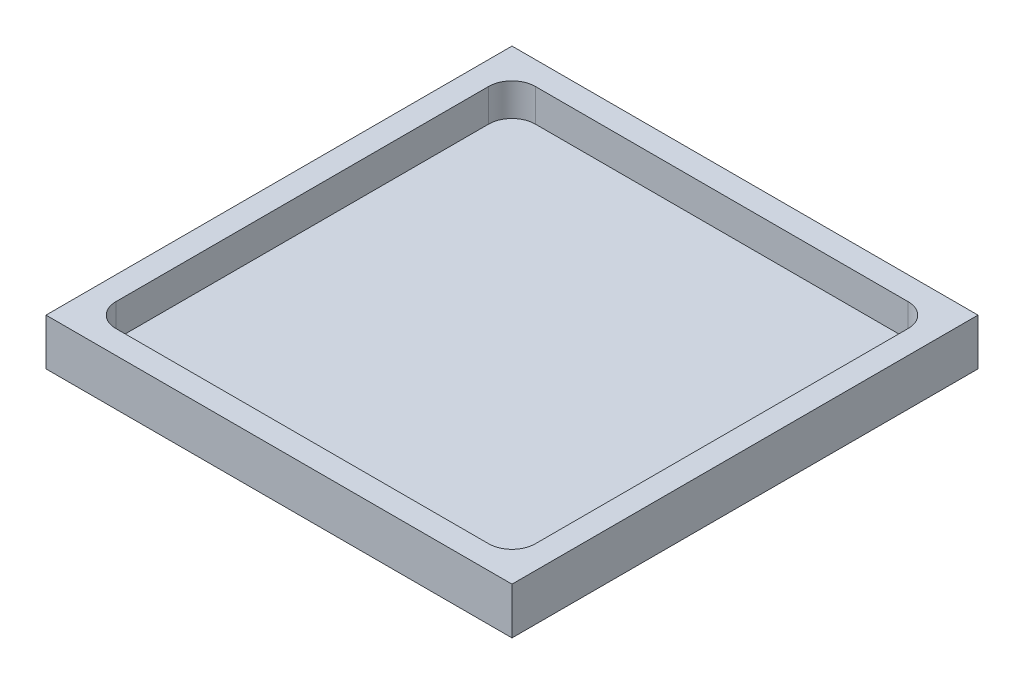
ISO-10303-21;
HEADER;
FILE_DESCRIPTION(('STEP AP214'),'2;1');
FILE_NAME('part.step','',(''),(''),'','','');
FILE_SCHEMA(('AUTOMOTIVE_DESIGN { 1 0 10303 214 1 1 1 1 }'));
ENDSEC;
DATA;
#1=APPLICATION_CONTEXT('core data for automotive mechanical design processes');
#2=APPLICATION_PROTOCOL_DEFINITION('international standard','automotive_design',2000,#1);
#3=PRODUCT_CONTEXT('',#1,'mechanical');
#4=PRODUCT('Part','Part','',(#3));
#5=PRODUCT_RELATED_PRODUCT_CATEGORY('part','',(#4));
#6=PRODUCT_DEFINITION_FORMATION('','',#4);
#7=PRODUCT_DEFINITION_CONTEXT('part definition',#1,'design');
#8=PRODUCT_DEFINITION('design','',#6,#7);
#9=PRODUCT_DEFINITION_SHAPE('','',#8);
#10=(LENGTH_UNIT() NAMED_UNIT(*) SI_UNIT(.MILLI.,.METRE.));
#11=(NAMED_UNIT(*) PLANE_ANGLE_UNIT() SI_UNIT($,.RADIAN.));
#12=(NAMED_UNIT(*) SI_UNIT($,.STERADIAN.) SOLID_ANGLE_UNIT());
#13=UNCERTAINTY_MEASURE_WITH_UNIT(LENGTH_MEASURE(1.E-05),#10,'distance_accuracy_value','');
#14=(GEOMETRIC_REPRESENTATION_CONTEXT(3) GLOBAL_UNCERTAINTY_ASSIGNED_CONTEXT((#13)) GLOBAL_UNIT_ASSIGNED_CONTEXT((#10,
#11,#12)) REPRESENTATION_CONTEXT('',''));
#15=CARTESIAN_POINT('',(0.,0.,0.));
#16=DIRECTION('',(0.,0.,1.));
#17=DIRECTION('',(1.,0.,0.));
#18=AXIS2_PLACEMENT_3D('',#15,#16,#17);
#19=CARTESIAN_POINT('',(0.,10.,0.));
#20=DIRECTION('',(1.,0.,0.));
#21=DIRECTION('',(0.,0.,-1.));
#22=AXIS2_PLACEMENT_3D('',#19,#20,#21);
#23=PLANE('',#22);
#24=DIRECTION('',(0.,0.,1.));
#25=VECTOR('',#24,1.);
#26=CARTESIAN_POINT('',(0.,0.,0.));
#27=LINE('',#26,#25);
#28=CARTESIAN_POINT('',(0.,0.,-100.));
#29=VERTEX_POINT('',#28);
#30=CARTESIAN_POINT('',(0.,0.,0.));
#31=VERTEX_POINT('',#30);
#32=EDGE_CURVE('E153',#29,#31,#27,.T.);
#33=ORIENTED_EDGE('',*,*,#32,.T.);
#34=DIRECTION('',(0.,-1.,0.));
#35=VECTOR('',#34,1.);
#36=CARTESIAN_POINT('',(0.,10.,0.));
#37=LINE('',#36,#35);
#38=CARTESIAN_POINT('',(0.,10.,0.));
#39=VERTEX_POINT('',#38);
#40=EDGE_CURVE('E132',#39,#31,#37,.T.);
#41=ORIENTED_EDGE('',*,*,#40,.F.);
#42=DIRECTION('',(0.,0.,1.));
#43=VECTOR('',#42,1.);
#44=CARTESIAN_POINT('',(0.,10.,0.));
#45=LINE('',#44,#43);
#46=CARTESIAN_POINT('',(0.,10.,-100.));
#47=VERTEX_POINT('',#46);
#48=EDGE_CURVE('E140',#47,#39,#45,.T.);
#49=ORIENTED_EDGE('',*,*,#48,.F.);
#50=DIRECTION('',(0.,-1.,0.));
#51=VECTOR('',#50,1.);
#52=CARTESIAN_POINT('',(0.,10.,-100.));
#53=LINE('',#52,#51);
#54=EDGE_CURVE('E257',#47,#29,#53,.T.);
#55=ORIENTED_EDGE('',*,*,#54,.T.);
#56=EDGE_LOOP('',(#33,#41,#49,#55));
#57=FACE_BOUND('',#56,.T.);
#58=ADVANCED_FACE('F39',(#57),#23,.F.);
#59=CARTESIAN_POINT('',(0.,10.,0.));
#60=DIRECTION('',(0.,0.,-1.));
#61=DIRECTION('',(-1.,0.,0.));
#62=AXIS2_PLACEMENT_3D('',#59,#60,#61);
#63=PLANE('',#62);
#64=DIRECTION('',(1.,0.,0.));
#65=VECTOR('',#64,1.);
#66=CARTESIAN_POINT('',(0.,0.,0.));
#67=LINE('',#66,#65);
#68=CARTESIAN_POINT('',(100.,0.,0.));
#69=VERTEX_POINT('',#68);
#70=EDGE_CURVE('E260',#31,#69,#67,.T.);
#71=ORIENTED_EDGE('',*,*,#70,.T.);
#72=DIRECTION('',(0.,-1.,0.));
#73=VECTOR('',#72,1.);
#74=CARTESIAN_POINT('',(100.,10.,0.));
#75=LINE('',#74,#73);
#76=CARTESIAN_POINT('',(100.,10.,0.));
#77=VERTEX_POINT('',#76);
#78=EDGE_CURVE('E135',#77,#69,#75,.T.);
#79=ORIENTED_EDGE('',*,*,#78,.F.);
#80=DIRECTION('',(1.,0.,0.));
#81=VECTOR('',#80,1.);
#82=CARTESIAN_POINT('',(0.,10.,0.));
#83=LINE('',#82,#81);
#84=EDGE_CURVE('E128',#39,#77,#83,.T.);
#85=ORIENTED_EDGE('',*,*,#84,.F.);
#86=ORIENTED_EDGE('',*,*,#40,.T.);
#87=EDGE_LOOP('',(#71,#79,#85,#86));
#88=FACE_BOUND('',#87,.T.);
#89=ADVANCED_FACE('F130',(#88),#63,.F.);
#90=CARTESIAN_POINT('',(100.,10.,0.));
#91=DIRECTION('',(-1.,0.,0.));
#92=DIRECTION('',(0.,0.,1.));
#93=AXIS2_PLACEMENT_3D('',#90,#91,#92);
#94=PLANE('',#93);
#95=DIRECTION('',(0.,0.,-1.));
#96=VECTOR('',#95,1.);
#97=CARTESIAN_POINT('',(100.,0.,0.));
#98=LINE('',#97,#96);
#99=CARTESIAN_POINT('',(100.,0.,-100.));
#100=VERTEX_POINT('',#99);
#101=EDGE_CURVE('E263',#69,#100,#98,.T.);
#102=ORIENTED_EDGE('',*,*,#101,.T.);
#103=DIRECTION('',(0.,-1.,0.));
#104=VECTOR('',#103,1.);
#105=CARTESIAN_POINT('',(100.,10.,-100.));
#106=LINE('',#105,#104);
#107=CARTESIAN_POINT('',(100.,10.,-100.));
#108=VERTEX_POINT('',#107);
#109=EDGE_CURVE('E161',#108,#100,#106,.T.);
#110=ORIENTED_EDGE('',*,*,#109,.F.);
#111=DIRECTION('',(0.,0.,-1.));
#112=VECTOR('',#111,1.);
#113=CARTESIAN_POINT('',(100.,10.,0.));
#114=LINE('',#113,#112);
#115=EDGE_CURVE('E139',#77,#108,#114,.T.);
#116=ORIENTED_EDGE('',*,*,#115,.F.);
#117=ORIENTED_EDGE('',*,*,#78,.T.);
#118=EDGE_LOOP('',(#102,#110,#116,#117));
#119=FACE_BOUND('',#118,.T.);
#120=ADVANCED_FACE('F279',(#119),#94,.F.);
#121=CARTESIAN_POINT('',(0.,10.,-100.));
#122=DIRECTION('',(0.,0.,1.));
#123=DIRECTION('',(1.,0.,0.));
#124=AXIS2_PLACEMENT_3D('',#121,#122,#123);
#125=PLANE('',#124);
#126=DIRECTION('',(-1.,0.,0.));
#127=VECTOR('',#126,1.);
#128=CARTESIAN_POINT('',(0.,0.,-100.));
#129=LINE('',#128,#127);
#130=EDGE_CURVE('E150',#100,#29,#129,.T.);
#131=ORIENTED_EDGE('',*,*,#130,.T.);
#132=ORIENTED_EDGE('',*,*,#54,.F.);
#133=DIRECTION('',(-1.,0.,0.));
#134=VECTOR('',#133,1.);
#135=CARTESIAN_POINT('',(0.,10.,-100.));
#136=LINE('',#135,#134);
#137=EDGE_CURVE('E145',#108,#47,#136,.T.);
#138=ORIENTED_EDGE('',*,*,#137,.F.);
#139=ORIENTED_EDGE('',*,*,#109,.T.);
#140=EDGE_LOOP('',(#131,#132,#138,#139));
#141=FACE_BOUND('',#140,.T.);
#142=ADVANCED_FACE('F274',(#141),#125,.F.);
#143=CARTESIAN_POINT('',(0.,10.,0.));
#144=DIRECTION('',(0.,-1.,0.));
#145=DIRECTION('',(0.,0.,-1.));
#146=AXIS2_PLACEMENT_3D('',#143,#144,#145);
#147=PLANE('',#146);
#148=DIRECTION('',(1.,0.,0.));
#149=VECTOR('',#148,1.);
#150=CARTESIAN_POINT('',(5.00000000000001,10.,-5.00000000000002));
#151=LINE('',#150,#149);
#152=CARTESIAN_POINT('',(10.,10.,-5.00000000000002));
#153=VERTEX_POINT('',#152);
#154=CARTESIAN_POINT('',(90.,10.,-5.00000000000001));
#155=VERTEX_POINT('',#154);
#156=EDGE_CURVE('E208',#153,#155,#151,.T.);
#157=ORIENTED_EDGE('',*,*,#156,.F.);
#158=CARTESIAN_POINT('',(10.,10.,-10.));
#159=DIRECTION('',(0.,-1.,0.));
#160=DIRECTION('',(0.,0.,-1.));
#161=AXIS2_PLACEMENT_3D('',#158,#159,#160);
#162=CIRCLE('',#161,5.);
#163=CARTESIAN_POINT('',(5.00000000000001,10.,-10.));
#164=VERTEX_POINT('',#163);
#165=EDGE_CURVE('E48',#153,#164,#162,.T.);
#166=ORIENTED_EDGE('',*,*,#165,.T.);
#167=DIRECTION('',(0.,0.,1.));
#168=VECTOR('',#167,1.);
#169=CARTESIAN_POINT('',(5.,10.,-95.));
#170=LINE('',#169,#168);
#171=CARTESIAN_POINT('',(5.,10.,-90.));
#172=VERTEX_POINT('',#171);
#173=EDGE_CURVE('E220',#172,#164,#170,.T.);
#174=ORIENTED_EDGE('',*,*,#173,.F.);
#175=CARTESIAN_POINT('',(10.,10.,-90.));
#176=DIRECTION('',(0.,-1.,0.));
#177=DIRECTION('',(0.,0.,-1.));
#178=AXIS2_PLACEMENT_3D('',#175,#176,#177);
#179=CIRCLE('',#178,5.);
#180=CARTESIAN_POINT('',(10.,10.,-95.));
#181=VERTEX_POINT('',#180);
#182=EDGE_CURVE('E11',#172,#181,#179,.T.);
#183=ORIENTED_EDGE('',*,*,#182,.T.);
#184=DIRECTION('',(-1.,0.,0.));
#185=VECTOR('',#184,1.);
#186=CARTESIAN_POINT('',(5.,10.,-95.));
#187=LINE('',#186,#185);
#188=CARTESIAN_POINT('',(90.,10.,-95.));
#189=VERTEX_POINT('',#188);
#190=EDGE_CURVE('E249',#189,#181,#187,.T.);
#191=ORIENTED_EDGE('',*,*,#190,.F.);
#192=CARTESIAN_POINT('',(90.,10.,-90.));
#193=DIRECTION('',(0.,-1.,0.));
#194=DIRECTION('',(0.,0.,-1.));
#195=AXIS2_PLACEMENT_3D('',#192,#193,#194);
#196=CIRCLE('',#195,5.);
#197=CARTESIAN_POINT('',(95.,10.,-90.));
#198=VERTEX_POINT('',#197);
#199=EDGE_CURVE('E200',#189,#198,#196,.T.);
#200=ORIENTED_EDGE('',*,*,#199,.T.);
#201=DIRECTION('',(0.,0.,-1.));
#202=VECTOR('',#201,1.);
#203=CARTESIAN_POINT('',(95.,10.,-95.));
#204=LINE('',#203,#202);
#205=CARTESIAN_POINT('',(95.,10.,-10.));
#206=VERTEX_POINT('',#205);
#207=EDGE_CURVE('E210',#206,#198,#204,.T.);
#208=ORIENTED_EDGE('',*,*,#207,.F.);
#209=CARTESIAN_POINT('',(90.,10.,-10.));
#210=DIRECTION('',(0.,-1.,0.));
#211=DIRECTION('',(0.,0.,-1.));
#212=AXIS2_PLACEMENT_3D('',#209,#210,#211);
#213=CIRCLE('',#212,5.);
#214=EDGE_CURVE('E203',#206,#155,#213,.T.);
#215=ORIENTED_EDGE('',*,*,#214,.T.);
#216=EDGE_LOOP('',(#157,#166,#174,#183,#191,#200,#208,#215));
#217=FACE_BOUND('',#216,.T.);
#218=ORIENTED_EDGE('',*,*,#48,.T.);
#219=ORIENTED_EDGE('',*,*,#84,.T.);
#220=ORIENTED_EDGE('',*,*,#115,.T.);
#221=ORIENTED_EDGE('',*,*,#137,.T.);
#222=EDGE_LOOP('',(#218,#219,#220,#221));
#223=FACE_BOUND('',#222,.T.);
#224=ADVANCED_FACE('F143',(#217,#223),#147,.F.);
#225=CARTESIAN_POINT('',(0.,0.,0.));
#226=DIRECTION('',(0.,-1.,0.));
#227=DIRECTION('',(0.,0.,-1.));
#228=AXIS2_PLACEMENT_3D('',#225,#226,#227);
#229=PLANE('',#228);
#230=ORIENTED_EDGE('',*,*,#32,.F.);
#231=ORIENTED_EDGE('',*,*,#130,.F.);
#232=ORIENTED_EDGE('',*,*,#101,.F.);
#233=ORIENTED_EDGE('',*,*,#70,.F.);
#234=EDGE_LOOP('',(#230,#231,#232,#233));
#235=FACE_BOUND('',#234,.T.);
#236=ADVANCED_FACE('F278',(#235),#229,.T.);
#237=CARTESIAN_POINT('',(5.,3.,-95.));
#238=DIRECTION('',(-1.,0.,0.));
#239=DIRECTION('',(0.,0.,1.));
#240=AXIS2_PLACEMENT_3D('',#237,#238,#239);
#241=PLANE('',#240);
#242=ORIENTED_EDGE('',*,*,#173,.T.);
#243=DIRECTION('',(0.,1.,0.));
#244=VECTOR('',#243,1.);
#245=CARTESIAN_POINT('',(5.00000000000001,3.,-10.));
#246=LINE('',#245,#244);
#247=CARTESIAN_POINT('',(5.00000000000001,3.,-10.));
#248=VERTEX_POINT('',#247);
#249=EDGE_CURVE('E197',#164,#248,#246,.F.);
#250=ORIENTED_EDGE('',*,*,#249,.T.);
#251=DIRECTION('',(0.,0.,1.));
#252=VECTOR('',#251,1.);
#253=CARTESIAN_POINT('',(5.,3.,-95.));
#254=LINE('',#253,#252);
#255=CARTESIAN_POINT('',(5.,3.,-90.));
#256=VERTEX_POINT('',#255);
#257=EDGE_CURVE('E241',#256,#248,#254,.T.);
#258=ORIENTED_EDGE('',*,*,#257,.F.);
#259=DIRECTION('',(0.,1.,0.));
#260=VECTOR('',#259,1.);
#261=CARTESIAN_POINT('',(5.,10.,-90.));
#262=LINE('',#261,#260);
#263=EDGE_CURVE('E194',#256,#172,#262,.T.);
#264=ORIENTED_EDGE('',*,*,#263,.T.);
#265=EDGE_LOOP('',(#242,#250,#258,#264));
#266=FACE_BOUND('',#265,.T.);
#267=ADVANCED_FACE('F311',(#266),#241,.F.);
#268=CARTESIAN_POINT('',(5.,3.,-95.));
#269=DIRECTION('',(0.,0.,-1.));
#270=DIRECTION('',(-1.,0.,0.));
#271=AXIS2_PLACEMENT_3D('',#268,#269,#270);
#272=PLANE('',#271);
#273=DIRECTION('',(-1.,0.,0.));
#274=VECTOR('',#273,1.);
#275=CARTESIAN_POINT('',(5.,3.,-95.));
#276=LINE('',#275,#274);
#277=CARTESIAN_POINT('',(90.,3.,-95.));
#278=VERTEX_POINT('',#277);
#279=CARTESIAN_POINT('',(10.,3.,-95.));
#280=VERTEX_POINT('',#279);
#281=EDGE_CURVE('E235',#278,#280,#276,.T.);
#282=ORIENTED_EDGE('',*,*,#281,.F.);
#283=DIRECTION('',(0.,1.,0.));
#284=VECTOR('',#283,1.);
#285=CARTESIAN_POINT('',(90.,10.,-95.));
#286=LINE('',#285,#284);
#287=EDGE_CURVE('E159',#278,#189,#286,.T.);
#288=ORIENTED_EDGE('',*,*,#287,.T.);
#289=ORIENTED_EDGE('',*,*,#190,.T.);
#290=DIRECTION('',(0.,1.,0.));
#291=VECTOR('',#290,1.);
#292=CARTESIAN_POINT('',(10.,3.,-95.));
#293=LINE('',#292,#291);
#294=EDGE_CURVE('E155',#181,#280,#293,.F.);
#295=ORIENTED_EDGE('',*,*,#294,.T.);
#296=EDGE_LOOP('',(#282,#288,#289,#295));
#297=FACE_BOUND('',#296,.T.);
#298=ADVANCED_FACE('F314',(#297),#272,.F.);
#299=CARTESIAN_POINT('',(95.,3.,-95.));
#300=DIRECTION('',(1.,0.,0.));
#301=DIRECTION('',(0.,0.,-1.));
#302=AXIS2_PLACEMENT_3D('',#299,#300,#301);
#303=PLANE('',#302);
#304=ORIENTED_EDGE('',*,*,#207,.T.);
#305=DIRECTION('',(0.,1.,0.));
#306=VECTOR('',#305,1.);
#307=CARTESIAN_POINT('',(95.,3.,-90.));
#308=LINE('',#307,#306);
#309=CARTESIAN_POINT('',(95.,3.,-90.));
#310=VERTEX_POINT('',#309);
#311=EDGE_CURVE('E172',#198,#310,#308,.F.);
#312=ORIENTED_EDGE('',*,*,#311,.T.);
#313=DIRECTION('',(0.,0.,-1.));
#314=VECTOR('',#313,1.);
#315=CARTESIAN_POINT('',(95.,3.,-95.));
#316=LINE('',#315,#314);
#317=CARTESIAN_POINT('',(95.,3.,-10.));
#318=VERTEX_POINT('',#317);
#319=EDGE_CURVE('E228',#318,#310,#316,.T.);
#320=ORIENTED_EDGE('',*,*,#319,.F.);
#321=DIRECTION('',(0.,1.,0.));
#322=VECTOR('',#321,1.);
#323=CARTESIAN_POINT('',(95.,10.,-10.));
#324=LINE('',#323,#322);
#325=EDGE_CURVE('E168',#318,#206,#324,.T.);
#326=ORIENTED_EDGE('',*,*,#325,.T.);
#327=EDGE_LOOP('',(#304,#312,#320,#326));
#328=FACE_BOUND('',#327,.T.);
#329=ADVANCED_FACE('F232',(#328),#303,.F.);
#330=CARTESIAN_POINT('',(5.00000000000001,3.,-5.00000000000002));
#331=DIRECTION('',(0.,0.,1.));
#332=DIRECTION('',(1.,0.,0.));
#333=AXIS2_PLACEMENT_3D('',#330,#331,#332);
#334=PLANE('',#333);
#335=ORIENTED_EDGE('',*,*,#156,.T.);
#336=DIRECTION('',(0.,1.,0.));
#337=VECTOR('',#336,1.);
#338=CARTESIAN_POINT('',(90.,3.,-5.00000000000001));
#339=LINE('',#338,#337);
#340=CARTESIAN_POINT('',(90.,3.,-5.00000000000001));
#341=VERTEX_POINT('',#340);
#342=EDGE_CURVE('E191',#155,#341,#339,.F.);
#343=ORIENTED_EDGE('',*,*,#342,.T.);
#344=DIRECTION('',(1.,0.,0.));
#345=VECTOR('',#344,1.);
#346=CARTESIAN_POINT('',(5.00000000000001,3.,-5.00000000000002));
#347=LINE('',#346,#345);
#348=CARTESIAN_POINT('',(10.,3.,-5.00000000000002));
#349=VERTEX_POINT('',#348);
#350=EDGE_CURVE('E230',#349,#341,#347,.T.);
#351=ORIENTED_EDGE('',*,*,#350,.F.);
#352=DIRECTION('',(0.,1.,0.));
#353=VECTOR('',#352,1.);
#354=CARTESIAN_POINT('',(10.,10.,-5.00000000000002));
#355=LINE('',#354,#353);
#356=EDGE_CURVE('E187',#349,#153,#355,.T.);
#357=ORIENTED_EDGE('',*,*,#356,.T.);
#358=EDGE_LOOP('',(#335,#343,#351,#357));
#359=FACE_BOUND('',#358,.T.);
#360=ADVANCED_FACE('F215',(#359),#334,.F.);
#361=CARTESIAN_POINT('',(0.,3.,0.));
#362=DIRECTION('',(0.,1.,0.));
#363=DIRECTION('',(0.,0.,1.));
#364=AXIS2_PLACEMENT_3D('',#361,#362,#363);
#365=PLANE('',#364);
#366=ORIENTED_EDGE('',*,*,#319,.T.);
#367=CARTESIAN_POINT('',(90.,3.,-90.));
#368=DIRECTION('',(0.,1.,0.));
#369=DIRECTION('',(0.,0.,1.));
#370=AXIS2_PLACEMENT_3D('',#367,#368,#369);
#371=CIRCLE('',#370,5.);
#372=EDGE_CURVE('E184',#310,#278,#371,.T.);
#373=ORIENTED_EDGE('',*,*,#372,.T.);
#374=ORIENTED_EDGE('',*,*,#281,.T.);
#375=CARTESIAN_POINT('',(10.,3.,-90.));
#376=DIRECTION('',(0.,1.,0.));
#377=DIRECTION('',(0.,0.,1.));
#378=AXIS2_PLACEMENT_3D('',#375,#376,#377);
#379=CIRCLE('',#378,5.);
#380=EDGE_CURVE('E175',#280,#256,#379,.T.);
#381=ORIENTED_EDGE('',*,*,#380,.T.);
#382=ORIENTED_EDGE('',*,*,#257,.T.);
#383=CARTESIAN_POINT('',(10.,3.,-10.));
#384=DIRECTION('',(0.,1.,0.));
#385=DIRECTION('',(0.,0.,1.));
#386=AXIS2_PLACEMENT_3D('',#383,#384,#385);
#387=CIRCLE('',#386,5.);
#388=EDGE_CURVE('E178',#248,#349,#387,.T.);
#389=ORIENTED_EDGE('',*,*,#388,.T.);
#390=ORIENTED_EDGE('',*,*,#350,.T.);
#391=CARTESIAN_POINT('',(90.,3.,-10.));
#392=DIRECTION('',(0.,1.,0.));
#393=DIRECTION('',(0.,0.,1.));
#394=AXIS2_PLACEMENT_3D('',#391,#392,#393);
#395=CIRCLE('',#394,5.);
#396=EDGE_CURVE('E181',#341,#318,#395,.T.);
#397=ORIENTED_EDGE('',*,*,#396,.T.);
#398=EDGE_LOOP('',(#366,#373,#374,#381,#382,#389,#390,#397));
#399=FACE_BOUND('',#398,.T.);
#400=ADVANCED_FACE('F227',(#399),#365,.T.);
#401=CARTESIAN_POINT('',(90.,3.,-90.));
#402=DIRECTION('',(0.,-1.,0.));
#403=DIRECTION('',(0.,0.,-1.));
#404=AXIS2_PLACEMENT_3D('',#401,#402,#403);
#405=CYLINDRICAL_SURFACE('',#404,5.);
#406=ORIENTED_EDGE('',*,*,#372,.F.);
#407=ORIENTED_EDGE('',*,*,#311,.F.);
#408=ORIENTED_EDGE('',*,*,#199,.F.);
#409=ORIENTED_EDGE('',*,*,#287,.F.);
#410=EDGE_LOOP('',(#406,#407,#408,#409));
#411=FACE_BOUND('',#410,.T.);
#412=ADVANCED_FACE('F293',(#411),#405,.F.);
#413=CARTESIAN_POINT('',(90.,3.,-10.));
#414=DIRECTION('',(0.,-1.,0.));
#415=DIRECTION('',(0.,0.,-1.));
#416=AXIS2_PLACEMENT_3D('',#413,#414,#415);
#417=CYLINDRICAL_SURFACE('',#416,5.);
#418=ORIENTED_EDGE('',*,*,#396,.F.);
#419=ORIENTED_EDGE('',*,*,#342,.F.);
#420=ORIENTED_EDGE('',*,*,#214,.F.);
#421=ORIENTED_EDGE('',*,*,#325,.F.);
#422=EDGE_LOOP('',(#418,#419,#420,#421));
#423=FACE_BOUND('',#422,.T.);
#424=ADVANCED_FACE('F223',(#423),#417,.F.);
#425=CARTESIAN_POINT('',(10.,3.,-10.));
#426=DIRECTION('',(0.,-1.,0.));
#427=DIRECTION('',(0.,0.,-1.));
#428=AXIS2_PLACEMENT_3D('',#425,#426,#427);
#429=CYLINDRICAL_SURFACE('',#428,5.);
#430=ORIENTED_EDGE('',*,*,#388,.F.);
#431=ORIENTED_EDGE('',*,*,#249,.F.);
#432=ORIENTED_EDGE('',*,*,#165,.F.);
#433=ORIENTED_EDGE('',*,*,#356,.F.);
#434=EDGE_LOOP('',(#430,#431,#432,#433));
#435=FACE_BOUND('',#434,.T.);
#436=ADVANCED_FACE('F298',(#435),#429,.F.);
#437=CARTESIAN_POINT('',(10.,3.,-90.));
#438=DIRECTION('',(0.,-1.,0.));
#439=DIRECTION('',(0.,0.,-1.));
#440=AXIS2_PLACEMENT_3D('',#437,#438,#439);
#441=CYLINDRICAL_SURFACE('',#440,5.);
#442=ORIENTED_EDGE('',*,*,#380,.F.);
#443=ORIENTED_EDGE('',*,*,#294,.F.);
#444=ORIENTED_EDGE('',*,*,#182,.F.);
#445=ORIENTED_EDGE('',*,*,#263,.F.);
#446=EDGE_LOOP('',(#442,#443,#444,#445));
#447=FACE_BOUND('',#446,.T.);
#448=ADVANCED_FACE('F41',(#447),#441,.F.);
#449=CLOSED_SHELL('',(#58,#89,#120,#142,#224,#236,#267,#298,#329,#360,#400,#412,#424,#436,#448));
#450=MANIFOLD_SOLID_BREP('B2',#449);
#451=ADVANCED_BREP_SHAPE_REPRESENTATION('',(#18,#450),#14);
#452=SHAPE_DEFINITION_REPRESENTATION(#9,#451);
ENDSEC;
END-ISO-10303-21;
